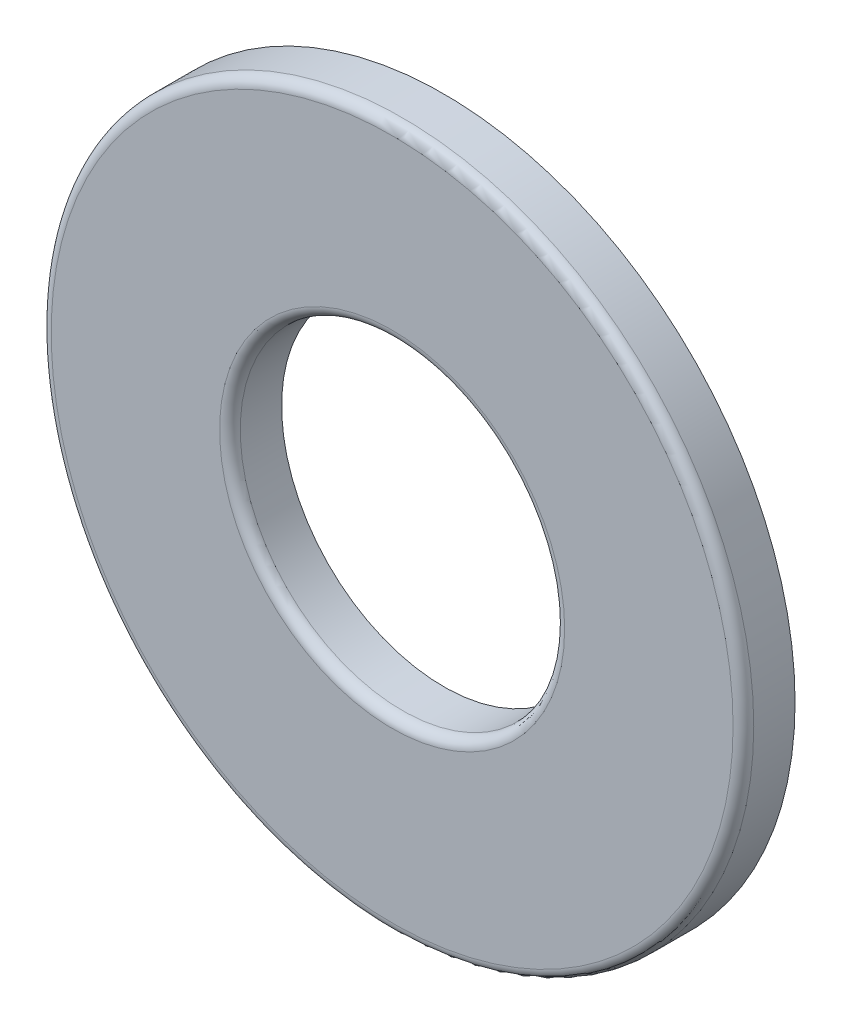
ISO-10303-21;
HEADER;
FILE_DESCRIPTION(('STEP AP214'),'2;1');
FILE_NAME('part.step','',(''),(''),'','','');
FILE_SCHEMA(('AUTOMOTIVE_DESIGN { 1 0 10303 214 1 1 1 1 }'));
ENDSEC;
DATA;
#1=APPLICATION_CONTEXT('core data for automotive mechanical design processes');
#2=APPLICATION_PROTOCOL_DEFINITION('international standard','automotive_design',2000,#1);
#3=PRODUCT_CONTEXT('',#1,'mechanical');
#4=PRODUCT('Part','Part','',(#3));
#5=PRODUCT_RELATED_PRODUCT_CATEGORY('part','',(#4));
#6=PRODUCT_DEFINITION_FORMATION('','',#4);
#7=PRODUCT_DEFINITION_CONTEXT('part definition',#1,'design');
#8=PRODUCT_DEFINITION('design','',#6,#7);
#9=PRODUCT_DEFINITION_SHAPE('','',#8);
#10=(LENGTH_UNIT() NAMED_UNIT(*) SI_UNIT(.MILLI.,.METRE.));
#11=(NAMED_UNIT(*) PLANE_ANGLE_UNIT() SI_UNIT($,.RADIAN.));
#12=(NAMED_UNIT(*) SI_UNIT($,.STERADIAN.) SOLID_ANGLE_UNIT());
#13=UNCERTAINTY_MEASURE_WITH_UNIT(LENGTH_MEASURE(1.E-05),#10,'distance_accuracy_value','');
#14=(GEOMETRIC_REPRESENTATION_CONTEXT(3) GLOBAL_UNCERTAINTY_ASSIGNED_CONTEXT((#13)) GLOBAL_UNIT_ASSIGNED_CONTEXT((#10,
#11,#12)) REPRESENTATION_CONTEXT('',''));
#15=CARTESIAN_POINT('',(0.,0.,0.));
#16=DIRECTION('',(0.,0.,1.));
#17=DIRECTION('',(1.,0.,0.));
#18=AXIS2_PLACEMENT_3D('',#15,#16,#17);
#19=CARTESIAN_POINT('',(0.,0.,0.5));
#20=DIRECTION('',(0.,0.,1.));
#21=DIRECTION('',(1.,0.,0.));
#22=AXIS2_PLACEMENT_3D('',#19,#20,#21);
#23=PLANE('',#22);
#24=CARTESIAN_POINT('',(0.,0.,0.5));
#25=DIRECTION('',(0.,0.,1.));
#26=DIRECTION('',(1.,0.,0.));
#27=AXIS2_PLACEMENT_3D('',#24,#25,#26);
#28=CIRCLE('',#27,1.67);
#29=CARTESIAN_POINT('',(1.67,0.,0.5));
#30=VERTEX_POINT('',#29);
#31=EDGE_CURVE('E37',#30,#30,#28,.F.);
#32=ORIENTED_EDGE('',*,*,#31,.T.);
#33=EDGE_LOOP('',(#32));
#34=FACE_BOUND('',#33,.T.);
#35=CARTESIAN_POINT('',(0.,0.,0.5));
#36=DIRECTION('',(0.,0.,1.));
#37=DIRECTION('',(1.,0.,0.));
#38=AXIS2_PLACEMENT_3D('',#35,#36,#37);
#39=CIRCLE('',#38,3.3);
#40=CARTESIAN_POINT('',(3.3,0.,0.5));
#41=VERTEX_POINT('',#40);
#42=EDGE_CURVE('E41',#41,#41,#39,.T.);
#43=ORIENTED_EDGE('',*,*,#42,.T.);
#44=EDGE_LOOP('',(#43));
#45=FACE_BOUND('',#44,.T.);
#46=ADVANCED_FACE('F30',(#34,#45),#23,.T.);
#47=CARTESIAN_POINT('',(0.,0.,0.));
#48=DIRECTION('',(0.,0.,1.));
#49=DIRECTION('',(1.,0.,0.));
#50=AXIS2_PLACEMENT_3D('',#47,#48,#49);
#51=PLANE('',#50);
#52=CARTESIAN_POINT('',(0.,0.,0.));
#53=DIRECTION('',(0.,0.,1.));
#54=DIRECTION('',(1.,0.,0.));
#55=AXIS2_PLACEMENT_3D('',#52,#53,#54);
#56=CIRCLE('',#55,3.4);
#57=CARTESIAN_POINT('',(3.4,0.,0.));
#58=VERTEX_POINT('',#57);
#59=EDGE_CURVE('E50',#58,#58,#56,.T.);
#60=ORIENTED_EDGE('',*,*,#59,.F.);
#61=EDGE_LOOP('',(#60));
#62=FACE_BOUND('',#61,.T.);
#63=CARTESIAN_POINT('',(0.,0.,0.));
#64=DIRECTION('',(0.,0.,1.));
#65=DIRECTION('',(1.,0.,0.));
#66=AXIS2_PLACEMENT_3D('',#63,#64,#65);
#67=CIRCLE('',#66,1.57);
#68=CARTESIAN_POINT('',(1.57,0.,0.));
#69=VERTEX_POINT('',#68);
#70=EDGE_CURVE('E53',#69,#69,#67,.T.);
#71=ORIENTED_EDGE('',*,*,#70,.T.);
#72=EDGE_LOOP('',(#71));
#73=FACE_BOUND('',#72,.T.);
#74=ADVANCED_FACE('F57',(#62,#73),#51,.F.);
#75=CARTESIAN_POINT('',(0.,0.,0.5));
#76=DIRECTION('',(0.,0.,-1.));
#77=DIRECTION('',(-1.,0.,0.));
#78=AXIS2_PLACEMENT_3D('',#75,#76,#77);
#79=CYLINDRICAL_SURFACE('',#78,3.4);
#80=CARTESIAN_POINT('',(0.,0.,0.4));
#81=DIRECTION('',(0.,0.,1.));
#82=DIRECTION('',(1.,0.,0.));
#83=AXIS2_PLACEMENT_3D('',#80,#81,#82);
#84=CIRCLE('',#83,3.4);
#85=CARTESIAN_POINT('',(3.4,0.,0.4));
#86=VERTEX_POINT('',#85);
#87=EDGE_CURVE('E10',#86,#86,#84,.F.);
#88=ORIENTED_EDGE('',*,*,#87,.T.);
#89=EDGE_LOOP('',(#88));
#90=FACE_BOUND('',#89,.T.);
#91=ORIENTED_EDGE('',*,*,#59,.T.);
#92=EDGE_LOOP('',(#91));
#93=FACE_BOUND('',#92,.T.);
#94=ADVANCED_FACE('F62',(#90,#93),#79,.T.);
#95=CARTESIAN_POINT('',(0.,0.,0.5));
#96=DIRECTION('',(0.,0.,-1.));
#97=DIRECTION('',(-1.,0.,0.));
#98=AXIS2_PLACEMENT_3D('',#95,#96,#97);
#99=CYLINDRICAL_SURFACE('',#98,1.57);
#100=CARTESIAN_POINT('',(0.,0.,0.4));
#101=DIRECTION('',(0.,0.,1.));
#102=DIRECTION('',(1.,0.,0.));
#103=AXIS2_PLACEMENT_3D('',#100,#101,#102);
#104=CIRCLE('',#103,1.57);
#105=CARTESIAN_POINT('',(1.57,0.,0.4));
#106=VERTEX_POINT('',#105);
#107=EDGE_CURVE('E45',#106,#106,#104,.T.);
#108=ORIENTED_EDGE('',*,*,#107,.T.);
#109=EDGE_LOOP('',(#108));
#110=FACE_BOUND('',#109,.T.);
#111=ORIENTED_EDGE('',*,*,#70,.F.);
#112=EDGE_LOOP('',(#111));
#113=FACE_BOUND('',#112,.T.);
#114=ADVANCED_FACE('F59',(#110,#113),#99,.F.);
#115=CARTESIAN_POINT('',(0.,0.,0.4));
#116=DIRECTION('',(0.,0.,1.));
#117=DIRECTION('',(1.,0.,0.));
#118=AXIS2_PLACEMENT_3D('',#115,#116,#117);
#119=TOROIDAL_SURFACE('',#118,1.67,0.1);
#120=ORIENTED_EDGE('',*,*,#31,.F.);
#121=EDGE_LOOP('',(#120));
#122=FACE_BOUND('',#121,.T.);
#123=ORIENTED_EDGE('',*,*,#107,.F.);
#124=EDGE_LOOP('',(#123));
#125=FACE_BOUND('',#124,.T.);
#126=ADVANCED_FACE('F61',(#122,#125),#119,.T.);
#127=CARTESIAN_POINT('',(0.,0.,0.4));
#128=DIRECTION('',(0.,0.,1.));
#129=DIRECTION('',(1.,0.,0.));
#130=AXIS2_PLACEMENT_3D('',#127,#128,#129);
#131=TOROIDAL_SURFACE('',#130,3.3,0.1);
#132=ORIENTED_EDGE('',*,*,#87,.F.);
#133=EDGE_LOOP('',(#132));
#134=FACE_BOUND('',#133,.T.);
#135=ORIENTED_EDGE('',*,*,#42,.F.);
#136=EDGE_LOOP('',(#135));
#137=FACE_BOUND('',#136,.T.);
#138=ADVANCED_FACE('F32',(#134,#137),#131,.T.);
#139=CLOSED_SHELL('',(#46,#74,#94,#114,#126,#138));
#140=MANIFOLD_SOLID_BREP('B2',#139);
#141=ADVANCED_BREP_SHAPE_REPRESENTATION('',(#18,#140),#14);
#142=SHAPE_DEFINITION_REPRESENTATION(#9,#141);
ENDSEC;
END-ISO-10303-21;
